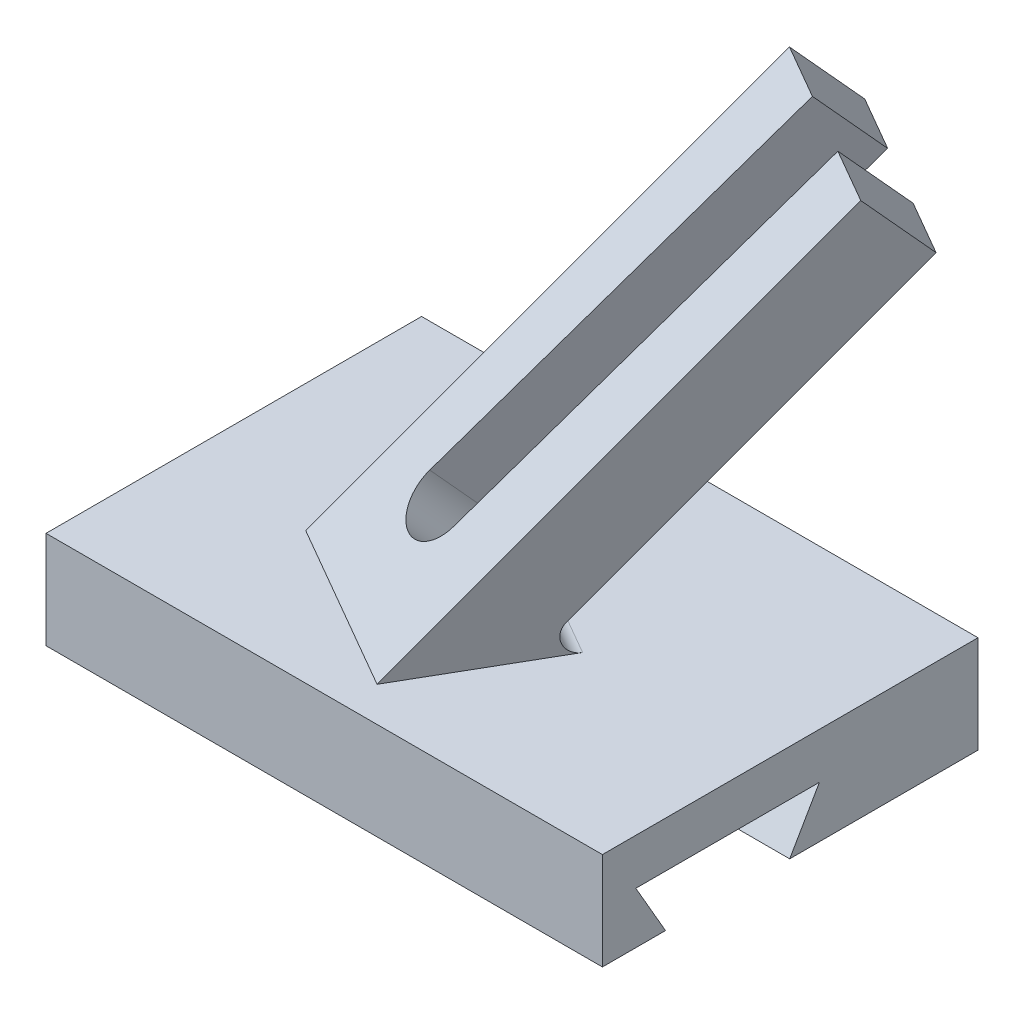
ISO-10303-21;
HEADER;
FILE_DESCRIPTION(('STEP AP214'),'2;1');
FILE_NAME('part.step','',(''),(''),'','','');
FILE_SCHEMA(('AUTOMOTIVE_DESIGN { 1 0 10303 214 1 1 1 1 }'));
ENDSEC;
DATA;
#1=APPLICATION_CONTEXT('core data for automotive mechanical design processes');
#2=APPLICATION_PROTOCOL_DEFINITION('international standard','automotive_design',2000,#1);
#3=PRODUCT_CONTEXT('',#1,'mechanical');
#4=PRODUCT('Part','Part','',(#3));
#5=PRODUCT_RELATED_PRODUCT_CATEGORY('part','',(#4));
#6=PRODUCT_DEFINITION_FORMATION('','',#4);
#7=PRODUCT_DEFINITION_CONTEXT('part definition',#1,'design');
#8=PRODUCT_DEFINITION('design','',#6,#7);
#9=PRODUCT_DEFINITION_SHAPE('','',#8);
#10=(LENGTH_UNIT() NAMED_UNIT(*) SI_UNIT(.MILLI.,.METRE.));
#11=(NAMED_UNIT(*) PLANE_ANGLE_UNIT() SI_UNIT($,.RADIAN.));
#12=(NAMED_UNIT(*) SI_UNIT($,.STERADIAN.) SOLID_ANGLE_UNIT());
#13=UNCERTAINTY_MEASURE_WITH_UNIT(LENGTH_MEASURE(1.E-05),#10,'distance_accuracy_value','');
#14=(GEOMETRIC_REPRESENTATION_CONTEXT(3) GLOBAL_UNCERTAINTY_ASSIGNED_CONTEXT((#13)) GLOBAL_UNIT_ASSIGNED_CONTEXT((#10,
#11,#12)) REPRESENTATION_CONTEXT('',''));
#15=CARTESIAN_POINT('',(0.,0.,0.));
#16=DIRECTION('',(0.,0.,1.));
#17=DIRECTION('',(1.,0.,0.));
#18=AXIS2_PLACEMENT_3D('',#15,#16,#17);
#19=CARTESIAN_POINT('',(0.,0.,0.));
#20=DIRECTION('',(0.,1.,0.));
#21=DIRECTION('',(0.,0.,1.));
#22=AXIS2_PLACEMENT_3D('',#19,#20,#21);
#23=PLANE('',#22);
#24=DIRECTION('',(0.,0.,-1.));
#25=VECTOR('',#24,1.);
#26=CARTESIAN_POINT('',(1.52272727272726,0.,-67.5459090909091));
#27=LINE('',#26,#25);
#28=CARTESIAN_POINT('',(1.52272727272727,0.,-33.1639712610649));
#29=VERTEX_POINT('',#28);
#30=CARTESIAN_POINT('',(1.52272727272726,0.,-67.5459090909091));
#31=VERTEX_POINT('',#30);
#32=EDGE_CURVE('E282',#29,#31,#27,.T.);
#33=ORIENTED_EDGE('',*,*,#32,.F.);
#34=DIRECTION('',(1.,0.,0.));
#35=VECTOR('',#34,1.);
#36=CARTESIAN_POINT('',(-100.077272727273,0.,-33.1639712610649));
#37=LINE('',#36,#35);
#38=CARTESIAN_POINT('',(-100.077272727273,0.,-33.1639712610649));
#39=VERTEX_POINT('',#38);
#40=EDGE_CURVE('E209',#39,#29,#37,.T.);
#41=ORIENTED_EDGE('',*,*,#40,.F.);
#42=DIRECTION('',(0.,0.,1.));
#43=VECTOR('',#42,1.);
#44=CARTESIAN_POINT('',(-100.077272727273,0.,-67.5459090909091));
#45=LINE('',#44,#43);
#46=CARTESIAN_POINT('',(-100.077272727273,0.,-67.5459090909091));
#47=VERTEX_POINT('',#46);
#48=EDGE_CURVE('E201',#47,#39,#45,.T.);
#49=ORIENTED_EDGE('',*,*,#48,.F.);
#50=DIRECTION('',(-1.,0.,0.));
#51=VECTOR('',#50,1.);
#52=CARTESIAN_POINT('',(-100.077272727273,0.,-67.5459090909091));
#53=LINE('',#52,#51);
#54=EDGE_CURVE('E272',#31,#47,#53,.T.);
#55=ORIENTED_EDGE('',*,*,#54,.F.);
#56=EDGE_LOOP('',(#33,#41,#49,#55));
#57=FACE_BOUND('',#56,.T.);
#58=ADVANCED_FACE('F39',(#57),#23,.F.);
#59=CARTESIAN_POINT('',(-39.4132706222002,72.3799572161006,-87.8016301362695));
#60=DIRECTION('',(0.353553390593269,0.707106781186549,-0.612372435695796));
#61=DIRECTION('',(0.,0.654653670707977,0.755928946018454));
#62=AXIS2_PLACEMENT_3D('',#59,#60,#61);
#63=PLANE('',#62);
#64=DIRECTION('',(-0.866025403784442,0.,-0.499999999999994));
#65=VECTOR('',#64,1.);
#66=CARTESIAN_POINT('',(-39.4132706222002,72.3799572161006,-87.8016301362695));
#67=LINE('',#66,#65);
#68=CARTESIAN_POINT('',(-8.61740726362549,72.3799572161006,-70.0216301362696));
#69=VERTEX_POINT('',#68);
#70=CARTESIAN_POINT('',(-18.5160776288816,72.3799572161006,-75.7366301362696));
#71=VERTEX_POINT('',#70);
#72=EDGE_CURVE('E246',#69,#71,#67,.T.);
#73=ORIENTED_EDGE('',*,*,#72,.T.);
#74=DIRECTION('',(-0.353553390593271,0.707106781186546,0.612372435695798));
#75=VECTOR('',#74,1.);
#76=CARTESIAN_POINT('',(-18.5160776288816,72.3799572161006,-75.7366301362696));
#77=LINE('',#76,#75);
#78=CARTESIAN_POINT('',(-23.5450210566803,82.437844071698,-67.0262446109326));
#79=VERTEX_POINT('',#78);
#80=EDGE_CURVE('E237',#71,#79,#77,.T.);
#81=ORIENTED_EDGE('',*,*,#80,.T.);
#82=DIRECTION('',(-0.866025403784442,0.,-0.499999999999994));
#83=VECTOR('',#82,1.);
#84=CARTESIAN_POINT('',(-44.4422140499989,82.437844071698,-79.0912446109324));
#85=LINE('',#84,#83);
#86=CARTESIAN_POINT('',(-13.6463506914242,82.437844071698,-61.3112446109326));
#87=VERTEX_POINT('',#86);
#88=EDGE_CURVE('E256',#87,#79,#85,.T.);
#89=ORIENTED_EDGE('',*,*,#88,.F.);
#90=DIRECTION('',(-0.353553390593271,0.707106781186546,0.612372435695798));
#91=VECTOR('',#90,1.);
#92=CARTESIAN_POINT('',(-8.61740726362549,72.3799572161006,-70.0216301362696));
#93=LINE('',#92,#91);
#94=EDGE_CURVE('E252',#69,#87,#93,.T.);
#95=ORIENTED_EDGE('',*,*,#94,.F.);
#96=EDGE_LOOP('',(#73,#81,#89,#95));
#97=FACE_BOUND('',#96,.T.);
#98=ADVANCED_FACE('F379',(#97),#63,.T.);
#99=CARTESIAN_POINT('',(-4.01203758387629,8.02407516775263,6.94905293714971));
#100=DIRECTION('',(0.353553390593271,-0.707106781186546,-0.612372435695798));
#101=DIRECTION('',(0.,0.65465367070798,-0.755928946018452));
#102=AXIS2_PLACEMENT_3D('',#99,#100,#101);
#103=PLANE('',#102);
#104=DIRECTION('',(-0.370564082989003,-0.706969255440777,0.602392506809333));
#105=VECTOR('',#104,1.);
#106=CARTESIAN_POINT('',(-62.7474262891084,8.97773515873692,-28.0630312477932));
#107=LINE('',#106,#105);
#108=CARTESIAN_POINT('',(-29.514600256944,72.3799572161006,-82.0866301362695));
#109=VERTEX_POINT('',#108);
#110=CARTESIAN_POINT('',(-55.4063078825857,22.9832614690566,-39.9968233304452));
#111=VERTEX_POINT('',#110);
#112=EDGE_CURVE('E221',#109,#111,#107,.T.);
#113=ORIENTED_EDGE('',*,*,#112,.T.);
#114=DIRECTION('',(-0.866025403784442,0.,-0.499999999999995));
#115=VECTOR('',#114,1.);
#116=CARTESIAN_POINT('',(-64.1116184957219,22.9832614690566,-45.0228367563186));
#117=LINE('',#116,#115);
#118=CARTESIAN_POINT('',(-64.1116184957219,22.9832614690566,-45.0228367563186));
#119=VERTEX_POINT('',#118);
#120=EDGE_CURVE('E305',#111,#119,#117,.T.);
#121=ORIENTED_EDGE('',*,*,#120,.T.);
#122=DIRECTION('',(-0.353553390593269,-0.707106781186549,0.612372435695796));
#123=VECTOR('',#122,1.);
#124=CARTESIAN_POINT('',(-71.7421926580488,7.72211314440257,-31.8062946162459));
#125=LINE('',#124,#123);
#126=CARTESIAN_POINT('',(-39.4132706222002,72.3799572161006,-87.8016301362695));
#127=VERTEX_POINT('',#126);
#128=EDGE_CURVE('E249',#127,#119,#125,.T.);
#129=ORIENTED_EDGE('',*,*,#128,.F.);
#130=EDGE_CURVE('E244',#109,#127,#67,.T.);
#131=ORIENTED_EDGE('',*,*,#130,.F.);
#132=EDGE_LOOP('',(#113,#121,#129,#131));
#133=FACE_BOUND('',#132,.T.);
#134=ADVANCED_FACE('F345',(#133),#103,.T.);
#135=DIRECTION('',(0.353553390593269,0.707106781186549,-0.612372435695796));
#136=VECTOR('',#135,1.);
#137=CARTESIAN_POINT('',(-8.61740726362549,72.3799572161006,-70.0216301362696));
#138=LINE('',#137,#136);
#139=CARTESIAN_POINT('',(-33.3157551371471,22.9832614690566,-27.2428367563188));
#140=VERTEX_POINT('',#139);
#141=EDGE_CURVE('E242',#140,#69,#138,.T.);
#142=ORIENTED_EDGE('',*,*,#141,.F.);
#143=DIRECTION('',(-0.866025403784442,0.,-0.499999999999995));
#144=VECTOR('',#143,1.);
#145=CARTESIAN_POINT('',(-46.8985065810605,22.9832614690566,-35.0848419587978));
#146=LINE('',#145,#144);
#147=CARTESIAN_POINT('',(-44.4077852545233,22.9832614690566,-33.6468233304453));
#148=VERTEX_POINT('',#147);
#149=EDGE_CURVE('E317',#140,#148,#146,.T.);
#150=ORIENTED_EDGE('',*,*,#149,.T.);
#151=DIRECTION('',(-0.370564082989003,-0.706969255440777,0.602392506809333));
#152=VECTOR('',#151,1.);
#153=CARTESIAN_POINT('',(-51.841717006566,8.80066408037458,-21.5621529882972));
#154=LINE('',#153,#152);
#155=EDGE_CURVE('E217',#71,#148,#154,.T.);
#156=ORIENTED_EDGE('',*,*,#155,.F.);
#157=ORIENTED_EDGE('',*,*,#72,.F.);
#158=EDGE_LOOP('',(#142,#150,#156,#157));
#159=FACE_BOUND('',#158,.T.);
#160=ADVANCED_FACE('F387',(#159),#103,.T.);
#161=CARTESIAN_POINT('',(-100.077272727273,17.78,-67.5459090909091));
#162=DIRECTION('',(1.,0.,0.));
#163=DIRECTION('',(0.,0.,-1.));
#164=AXIS2_PLACEMENT_3D('',#161,#162,#163);
#165=PLANE('',#164);
#166=ORIENTED_EDGE('',*,*,#48,.T.);
#167=DIRECTION('',(0.,0.866025403784436,-0.500000000000004));
#168=VECTOR('',#167,1.);
#169=CARTESIAN_POINT('',(-100.077272727273,9.39800000000001,-38.5899090909091));
#170=LINE('',#169,#168);
#171=CARTESIAN_POINT('',(-100.077272727273,9.39800000000001,-38.5899090909091));
#172=VERTEX_POINT('',#171);
#173=EDGE_CURVE('E180',#39,#172,#170,.T.);
#174=ORIENTED_EDGE('',*,*,#173,.T.);
#175=DIRECTION('',(0.,0.,1.));
#176=VECTOR('',#175,1.);
#177=CARTESIAN_POINT('',(-100.077272727273,9.398,-5.06190909090907));
#178=LINE('',#177,#176);
#179=CARTESIAN_POINT('',(-100.077272727273,9.398,-5.06190909090907));
#180=VERTEX_POINT('',#179);
#181=EDGE_CURVE('E191',#172,#180,#178,.T.);
#182=ORIENTED_EDGE('',*,*,#181,.T.);
#183=DIRECTION('',(0.,-0.86602540378444,-0.499999999999998));
#184=VECTOR('',#183,1.);
#185=CARTESIAN_POINT('',(-100.077272727273,9.398,-5.06190909090907));
#186=LINE('',#185,#184);
#187=CARTESIAN_POINT('',(-100.077272727273,0.,-10.4878469207531));
#188=VERTEX_POINT('',#187);
#189=EDGE_CURVE('E188',#180,#188,#186,.T.);
#190=ORIENTED_EDGE('',*,*,#189,.T.);
#191=CARTESIAN_POINT('',(-100.077272727273,0.,1.03409090909091));
#192=VERTEX_POINT('',#191);
#193=EDGE_CURVE('E266',#188,#192,#45,.T.);
#194=ORIENTED_EDGE('',*,*,#193,.T.);
#195=DIRECTION('',(0.,-1.,0.));
#196=VECTOR('',#195,1.);
#197=CARTESIAN_POINT('',(-100.077272727273,17.78,1.03409090909091));
#198=LINE('',#197,#196);
#199=CARTESIAN_POINT('',(-100.077272727273,17.78,1.03409090909091));
#200=VERTEX_POINT('',#199);
#201=EDGE_CURVE('E294',#200,#192,#198,.T.);
#202=ORIENTED_EDGE('',*,*,#201,.F.);
#203=DIRECTION('',(0.,0.,1.));
#204=VECTOR('',#203,1.);
#205=CARTESIAN_POINT('',(-100.077272727273,17.78,-67.5459090909091));
#206=LINE('',#205,#204);
#207=CARTESIAN_POINT('',(-100.077272727273,17.78,-67.5459090909091));
#208=VERTEX_POINT('',#207);
#209=EDGE_CURVE('E268',#208,#200,#206,.T.);
#210=ORIENTED_EDGE('',*,*,#209,.F.);
#211=DIRECTION('',(0.,-1.,0.));
#212=VECTOR('',#211,1.);
#213=CARTESIAN_POINT('',(-100.077272727273,17.78,-67.5459090909091));
#214=LINE('',#213,#212);
#215=EDGE_CURVE('E278',#208,#47,#214,.T.);
#216=ORIENTED_EDGE('',*,*,#215,.T.);
#217=EDGE_LOOP('',(#166,#174,#182,#190,#194,#202,#210,#216));
#218=FACE_BOUND('',#217,.T.);
#219=ADVANCED_FACE('F198',(#218),#165,.F.);
#220=CARTESIAN_POINT('',(-100.077272727273,17.78,1.03409090909091));
#221=DIRECTION('',(0.,0.,-1.));
#222=DIRECTION('',(-1.,0.,0.));
#223=AXIS2_PLACEMENT_3D('',#220,#221,#222);
#224=PLANE('',#223);
#225=DIRECTION('',(1.,0.,0.));
#226=VECTOR('',#225,1.);
#227=CARTESIAN_POINT('',(-100.077272727273,0.,1.03409090909091));
#228=LINE('',#227,#226);
#229=CARTESIAN_POINT('',(1.52272727272727,0.,1.03409090909091));
#230=VERTEX_POINT('',#229);
#231=EDGE_CURVE('E280',#192,#230,#228,.T.);
#232=ORIENTED_EDGE('',*,*,#231,.T.);
#233=DIRECTION('',(0.,-1.,0.));
#234=VECTOR('',#233,1.);
#235=CARTESIAN_POINT('',(1.52272727272727,17.78,1.03409090909091));
#236=LINE('',#235,#234);
#237=CARTESIAN_POINT('',(1.52272727272727,17.78,1.03409090909091));
#238=VERTEX_POINT('',#237);
#239=EDGE_CURVE('E291',#238,#230,#236,.T.);
#240=ORIENTED_EDGE('',*,*,#239,.F.);
#241=DIRECTION('',(1.,0.,0.));
#242=VECTOR('',#241,1.);
#243=CARTESIAN_POINT('',(-100.077272727273,17.78,1.03409090909091));
#244=LINE('',#243,#242);
#245=EDGE_CURVE('E271',#200,#238,#244,.T.);
#246=ORIENTED_EDGE('',*,*,#245,.F.);
#247=ORIENTED_EDGE('',*,*,#201,.T.);
#248=EDGE_LOOP('',(#232,#240,#246,#247));
#249=FACE_BOUND('',#248,.T.);
#250=ADVANCED_FACE('F442',(#249),#224,.F.);
#251=CARTESIAN_POINT('',(1.52272727272726,17.78,-67.5459090909091));
#252=DIRECTION('',(-1.,0.,0.));
#253=DIRECTION('',(0.,0.,1.));
#254=AXIS2_PLACEMENT_3D('',#251,#252,#253);
#255=PLANE('',#254);
#256=DIRECTION('',(0.,0.,1.));
#257=VECTOR('',#256,1.);
#258=CARTESIAN_POINT('',(1.52272727272727,9.398,-5.06190909090909));
#259=LINE('',#258,#257);
#260=CARTESIAN_POINT('',(1.52272727272727,9.39800000000001,-38.5899090909091));
#261=VERTEX_POINT('',#260);
#262=CARTESIAN_POINT('',(1.52272727272727,9.398,-5.06190909090909));
#263=VERTEX_POINT('',#262);
#264=EDGE_CURVE('E203',#261,#263,#259,.T.);
#265=ORIENTED_EDGE('',*,*,#264,.F.);
#266=DIRECTION('',(0.,0.866025403784436,-0.500000000000004));
#267=VECTOR('',#266,1.);
#268=CARTESIAN_POINT('',(1.52272727272727,9.39800000000001,-38.5899090909091));
#269=LINE('',#268,#267);
#270=EDGE_CURVE('E183',#29,#261,#269,.T.);
#271=ORIENTED_EDGE('',*,*,#270,.F.);
#272=ORIENTED_EDGE('',*,*,#32,.T.);
#273=DIRECTION('',(0.,-1.,0.));
#274=VECTOR('',#273,1.);
#275=CARTESIAN_POINT('',(1.52272727272726,17.78,-67.5459090909091));
#276=LINE('',#275,#274);
#277=CARTESIAN_POINT('',(1.52272727272726,17.78,-67.5459090909091));
#278=VERTEX_POINT('',#277);
#279=EDGE_CURVE('E288',#278,#31,#276,.T.);
#280=ORIENTED_EDGE('',*,*,#279,.F.);
#281=DIRECTION('',(0.,0.,-1.));
#282=VECTOR('',#281,1.);
#283=CARTESIAN_POINT('',(1.52272727272726,17.78,-67.5459090909091));
#284=LINE('',#283,#282);
#285=EDGE_CURVE('E274',#238,#278,#284,.T.);
#286=ORIENTED_EDGE('',*,*,#285,.F.);
#287=ORIENTED_EDGE('',*,*,#239,.T.);
#288=CARTESIAN_POINT('',(1.52272727272727,0.,-10.4878469207532));
#289=VERTEX_POINT('',#288);
#290=EDGE_CURVE('E283',#230,#289,#27,.T.);
#291=ORIENTED_EDGE('',*,*,#290,.T.);
#292=DIRECTION('',(0.,-0.86602540378444,-0.499999999999998));
#293=VECTOR('',#292,1.);
#294=CARTESIAN_POINT('',(1.52272727272727,9.398,-5.06190909090909));
#295=LINE('',#294,#293);
#296=EDGE_CURVE('E55',#263,#289,#295,.T.);
#297=ORIENTED_EDGE('',*,*,#296,.F.);
#298=EDGE_LOOP('',(#265,#271,#272,#280,#286,#287,#291,#297));
#299=FACE_BOUND('',#298,.T.);
#300=ADVANCED_FACE('F437',(#299),#255,.F.);
#301=CARTESIAN_POINT('',(-100.077272727273,17.78,-67.5459090909091));
#302=DIRECTION('',(0.,0.,1.));
#303=DIRECTION('',(1.,0.,0.));
#304=AXIS2_PLACEMENT_3D('',#301,#302,#303);
#305=PLANE('',#304);
#306=ORIENTED_EDGE('',*,*,#54,.T.);
#307=ORIENTED_EDGE('',*,*,#215,.F.);
#308=DIRECTION('',(-1.,0.,0.));
#309=VECTOR('',#308,1.);
#310=CARTESIAN_POINT('',(-100.077272727273,17.78,-67.5459090909091));
#311=LINE('',#310,#309);
#312=EDGE_CURVE('E276',#278,#208,#311,.T.);
#313=ORIENTED_EDGE('',*,*,#312,.F.);
#314=ORIENTED_EDGE('',*,*,#279,.T.);
#315=EDGE_LOOP('',(#306,#307,#313,#314));
#316=FACE_BOUND('',#315,.T.);
#317=ADVANCED_FACE('F429',(#316),#305,.F.);
#318=CARTESIAN_POINT('',(0.,17.78,0.));
#319=DIRECTION('',(0.,1.,0.));
#320=DIRECTION('',(0.,0.,1.));
#321=AXIS2_PLACEMENT_3D('',#318,#319,#320);
#322=PLANE('',#321);
#323=DIRECTION('',(-0.499999999999995,0.,0.866025403784442));
#324=VECTOR('',#323,1.);
#325=CARTESIAN_POINT('',(-67.5791740624975,17.78,-39.0168543365949));
#326=LINE('',#325,#324);
#327=CARTESIAN_POINT('',(-63.0339877611936,17.78,-46.8893479403194));
#328=VERTEX_POINT('',#327);
#329=CARTESIAN_POINT('',(-76.7711360858474,17.78,-23.0959090909089));
#330=VERTEX_POINT('',#329);
#331=EDGE_CURVE('E297',#328,#330,#326,.T.);
#332=ORIENTED_EDGE('',*,*,#331,.F.);
#333=DIRECTION('',(-0.866025403784442,0.,-0.499999999999995));
#334=VECTOR('',#333,1.);
#335=CARTESIAN_POINT('',(-51.9087290597549,17.78,-40.4661768342397));
#336=LINE('',#335,#334);
#337=CARTESIAN_POINT('',(-54.3625154334753,17.78,-41.8828710576409));
#338=VERTEX_POINT('',#337);
#339=EDGE_CURVE('E314',#328,#338,#336,.F.);
#340=ORIENTED_EDGE('',*,*,#339,.T.);
#341=CARTESIAN_POINT('',(-48.8055594595297,17.78,-38.8113768634507));
#342=DIRECTION('',(0.,1.,0.));
#343=DIRECTION('',(-0.499999999999995,0.,0.866025403784442));
#344=AXIS2_PLACEMENT_3D('',#341,#342,#343);
#345=ELLIPSE('',#344,8.97850954409787,6.34876498357973);
#346=CARTESIAN_POINT('',(-55.5879905288115,17.78,-34.0935090355031));
#347=VERTEX_POINT('',#346);
#348=EDGE_CURVE('E312',#338,#347,#345,.T.);
#349=ORIENTED_EDGE('',*,*,#348,.T.);
#350=DIRECTION('',(-0.866025403784442,0.,-0.499999999999995));
#351=VECTOR('',#350,1.);
#352=CARTESIAN_POINT('',(0.865924832247326,17.78,-1.49982580498795));
#353=LINE('',#352,#351);
#354=CARTESIAN_POINT('',(-49.5001373155887,17.78,-30.5786853440621));
#355=VERTEX_POINT('',#354);
#356=EDGE_CURVE('E300',#355,#347,#353,.T.);
#357=ORIENTED_EDGE('',*,*,#356,.F.);
#358=CARTESIAN_POINT('',(-48.8055594595297,17.78,-38.8113768634507));
#359=DIRECTION('',(0.,1.,0.));
#360=DIRECTION('',(-0.499999999999995,0.,0.866025403784442));
#361=AXIS2_PLACEMENT_3D('',#358,#359,#360);
#362=ELLIPSE('',#361,8.97850954409787,6.34876498357973);
#363=CARTESIAN_POINT('',(-43.3670894728118,17.78,-35.5346589193974));
#364=VERTEX_POINT('',#363);
#365=EDGE_CURVE('E63',#355,#364,#362,.T.);
#366=ORIENTED_EDGE('',*,*,#365,.T.);
#367=DIRECTION('',(-0.866025403784442,0.,-0.499999999999995));
#368=VECTOR('',#367,1.);
#369=CARTESIAN_POINT('',(-32.2381244026188,17.78,-29.1093479403196));
#370=LINE('',#369,#368);
#371=CARTESIAN_POINT('',(-32.2381244026189,17.78,-29.1093479403196));
#372=VERTEX_POINT('',#371);
#373=EDGE_CURVE('E308',#364,#372,#370,.F.);
#374=ORIENTED_EDGE('',*,*,#373,.T.);
#375=DIRECTION('',(0.499999999999995,0.,-0.866025403784442));
#376=VECTOR('',#375,1.);
#377=CARTESIAN_POINT('',(-36.7833107039227,17.78,-21.2368543365951));
#378=LINE('',#377,#376);
#379=CARTESIAN_POINT('',(-45.9752727272727,17.78,-5.31590909090908));
#380=VERTEX_POINT('',#379);
#381=EDGE_CURVE('E303',#380,#372,#378,.T.);
#382=ORIENTED_EDGE('',*,*,#381,.F.);
#383=DIRECTION('',(0.866025403784442,0.,0.499999999999995));
#384=VECTOR('',#383,1.);
#385=CARTESIAN_POINT('',(-45.9752727272727,17.78,-5.31590909090908));
#386=LINE('',#385,#384);
#387=EDGE_CURVE('E245',#330,#380,#386,.T.);
#388=ORIENTED_EDGE('',*,*,#387,.F.);
#389=EDGE_LOOP('',(#332,#340,#349,#357,#366,#374,#382,#388));
#390=FACE_BOUND('',#389,.T.);
#391=ORIENTED_EDGE('',*,*,#209,.T.);
#392=ORIENTED_EDGE('',*,*,#245,.T.);
#393=ORIENTED_EDGE('',*,*,#285,.T.);
#394=ORIENTED_EDGE('',*,*,#312,.T.);
#395=EDGE_LOOP('',(#391,#392,#393,#394));
#396=FACE_BOUND('',#395,.T.);
#397=ADVANCED_FACE('F393',(#390,#396),#322,.T.);
#398=ORIENTED_EDGE('',*,*,#193,.F.);
#399=DIRECTION('',(1.,0.,0.));
#400=VECTOR('',#399,1.);
#401=CARTESIAN_POINT('',(-100.077272727273,0.,-10.4878469207531));
#402=LINE('',#401,#400);
#403=EDGE_CURVE('E212',#188,#289,#402,.T.);
#404=ORIENTED_EDGE('',*,*,#403,.T.);
#405=ORIENTED_EDGE('',*,*,#290,.F.);
#406=ORIENTED_EDGE('',*,*,#231,.F.);
#407=EDGE_LOOP('',(#398,#404,#405,#406));
#408=FACE_BOUND('',#407,.T.);
#409=ADVANCED_FACE('F410',(#408),#23,.F.);
#410=CARTESIAN_POINT('',(-8.61740726362549,72.3799572161006,-70.0216301362696));
#411=DIRECTION('',(0.866025403784442,0.,0.499999999999995));
#412=DIRECTION('',(0.499999999999995,0.,-0.866025403784442));
#413=AXIS2_PLACEMENT_3D('',#410,#411,#412);
#414=PLANE('',#413);
#415=DIRECTION('',(0.353553390593269,0.707106781186549,-0.612372435695796));
#416=VECTOR('',#415,1.);
#417=CARTESIAN_POINT('',(-13.6463506914242,82.437844071698,-61.3112446109326));
#418=LINE('',#417,#416);
#419=EDGE_CURVE('E234',#380,#87,#418,.T.);
#420=ORIENTED_EDGE('',*,*,#419,.F.);
#421=ORIENTED_EDGE('',*,*,#381,.T.);
#422=CARTESIAN_POINT('',(-32.2381244026189,20.828,-29.1093479403196));
#423=DIRECTION('',(0.866025403784442,0.,0.499999999999995));
#424=DIRECTION('',(0.499999999999995,0.,-0.866025403784442));
#425=AXIS2_PLACEMENT_3D('',#422,#423,#424);
#426=CIRCLE('',#425,3.048);
#427=EDGE_CURVE('E11',#372,#140,#426,.F.);
#428=ORIENTED_EDGE('',*,*,#427,.T.);
#429=ORIENTED_EDGE('',*,*,#141,.T.);
#430=ORIENTED_EDGE('',*,*,#94,.T.);
#431=EDGE_LOOP('',(#420,#421,#428,#429,#430));
#432=FACE_BOUND('',#431,.T.);
#433=ADVANCED_FACE('F384',(#432),#414,.T.);
#434=CARTESIAN_POINT('',(-71.7421926580488,7.72211314440257,-31.8062946162459));
#435=DIRECTION('',(-0.866025403784442,0.,-0.499999999999995));
#436=DIRECTION('',(-0.499999999999995,0.,0.866025403784442));
#437=AXIS2_PLACEMENT_3D('',#434,#435,#436);
#438=PLANE('',#437);
#439=ORIENTED_EDGE('',*,*,#128,.T.);
#440=CARTESIAN_POINT('',(-63.0339877611936,20.828,-46.8893479403194));
#441=DIRECTION('',(-0.866025403784442,0.,-0.499999999999995));
#442=DIRECTION('',(-0.499999999999995,0.,0.866025403784442));
#443=AXIS2_PLACEMENT_3D('',#440,#441,#442);
#444=CIRCLE('',#443,3.048);
#445=EDGE_CURVE('E320',#119,#328,#444,.F.);
#446=ORIENTED_EDGE('',*,*,#445,.T.);
#447=ORIENTED_EDGE('',*,*,#331,.T.);
#448=DIRECTION('',(-0.353553390593269,-0.707106781186549,0.612372435695796));
#449=VECTOR('',#448,1.);
#450=CARTESIAN_POINT('',(-76.7711360858474,17.78,-23.0959090909089));
#451=LINE('',#450,#449);
#452=CARTESIAN_POINT('',(-44.4422140499989,82.437844071698,-79.0912446109324));
#453=VERTEX_POINT('',#452);
#454=EDGE_CURVE('E259',#453,#330,#451,.T.);
#455=ORIENTED_EDGE('',*,*,#454,.F.);
#456=DIRECTION('',(-0.353553390593271,0.707106781186546,0.612372435695798));
#457=VECTOR('',#456,1.);
#458=CARTESIAN_POINT('',(-39.4132706222002,72.3799572161006,-87.8016301362695));
#459=LINE('',#458,#457);
#460=EDGE_CURVE('E263',#127,#453,#459,.T.);
#461=ORIENTED_EDGE('',*,*,#460,.F.);
#462=EDGE_LOOP('',(#439,#446,#447,#455,#461));
#463=FACE_BOUND('',#462,.T.);
#464=ADVANCED_FACE('F367',(#463),#438,.T.);
#465=DIRECTION('',(-0.353553390593271,0.707106781186546,0.612372435695798));
#466=VECTOR('',#465,1.);
#467=CARTESIAN_POINT('',(-29.514600256944,72.3799572161006,-82.0866301362695));
#468=LINE('',#467,#466);
#469=CARTESIAN_POINT('',(-34.5435436847427,82.437844071698,-73.3762446109325));
#470=VERTEX_POINT('',#469);
#471=EDGE_CURVE('E235',#109,#470,#468,.T.);
#472=ORIENTED_EDGE('',*,*,#471,.F.);
#473=ORIENTED_EDGE('',*,*,#130,.T.);
#474=ORIENTED_EDGE('',*,*,#460,.T.);
#475=EDGE_CURVE('E255',#470,#453,#85,.T.);
#476=ORIENTED_EDGE('',*,*,#475,.F.);
#477=EDGE_LOOP('',(#472,#473,#474,#476));
#478=FACE_BOUND('',#477,.T.);
#479=ADVANCED_FACE('F373',(#478),#63,.T.);
#480=CARTESIAN_POINT('',(-9.04098101167497,18.0819620233501,15.6594384624867));
#481=DIRECTION('',(0.353553390593271,-0.707106781186546,-0.612372435695798));
#482=DIRECTION('',(0.,0.65465367070798,-0.755928946018452));
#483=AXIS2_PLACEMENT_3D('',#480,#481,#482);
#484=PLANE('',#483);
#485=CARTESIAN_POINT('',(-55.7037551186636,31.5763913182678,-26.8633515012796));
#486=DIRECTION('',(-0.353553390593271,0.707106781186546,0.612372435695798));
#487=DIRECTION('',(0.,-0.65465367070798,0.755928946018452));
#488=AXIS2_PLACEMENT_3D('',#485,#486,#487);
#489=CIRCLE('',#488,6.34876498357973);
#490=CARTESIAN_POINT('',(-50.2509004773924,31.4878557790866,-23.6129123715316));
#491=VERTEX_POINT('',#490);
#492=CARTESIAN_POINT('',(-61.1566097599349,31.664926857449,-30.1137906310276));
#493=VERTEX_POINT('',#492);
#494=EDGE_CURVE('E211',#491,#493,#489,.F.);
#495=ORIENTED_EDGE('',*,*,#494,.T.);
#496=DIRECTION('',(-0.370564082989003,-0.706969255440777,0.602392506809333));
#497=VECTOR('',#496,1.);
#498=CARTESIAN_POINT('',(-67.7763697169071,19.0356220143344,-19.3526457224562));
#499=LINE('',#498,#497);
#500=EDGE_CURVE('E218',#470,#493,#499,.T.);
#501=ORIENTED_EDGE('',*,*,#500,.F.);
#502=ORIENTED_EDGE('',*,*,#475,.T.);
#503=ORIENTED_EDGE('',*,*,#454,.T.);
#504=ORIENTED_EDGE('',*,*,#387,.T.);
#505=ORIENTED_EDGE('',*,*,#419,.T.);
#506=ORIENTED_EDGE('',*,*,#88,.T.);
#507=DIRECTION('',(-0.370564082989003,-0.706969255440777,0.602392506809333));
#508=VECTOR('',#507,1.);
#509=CARTESIAN_POINT('',(-56.8706604343646,18.858550935972,-12.8517674629602));
#510=LINE('',#509,#508);
#511=EDGE_CURVE('E227',#79,#491,#510,.T.);
#512=ORIENTED_EDGE('',*,*,#511,.T.);
#513=EDGE_LOOP('',(#495,#501,#502,#503,#504,#505,#506,#512));
#514=FACE_BOUND('',#513,.T.);
#515=ADVANCED_FACE('F342',(#514),#484,.F.);
#516=CARTESIAN_POINT('',(-50.6748116908649,21.5185044626704,-35.5737370266167));
#517=DIRECTION('',(-0.353553390593271,0.707106781186546,0.612372435695798));
#518=DIRECTION('',(0.,-0.65465367070798,0.755928946018452));
#519=AXIS2_PLACEMENT_3D('',#516,#517,#518);
#520=CYLINDRICAL_SURFACE('',#519,6.34876498357973);
#521=ORIENTED_EDGE('',*,*,#494,.F.);
#522=DIRECTION('',(-0.353553390593271,0.707106781186546,0.612372435695798));
#523=VECTOR('',#522,1.);
#524=CARTESIAN_POINT('',(-45.2219570495937,21.4299689234892,-32.3232978968687));
#525=LINE('',#524,#523);
#526=CARTESIAN_POINT('',(-44.8913929566518,20.7688407376055,-32.8958517010019));
#527=VERTEX_POINT('',#526);
#528=EDGE_CURVE('E224',#527,#491,#525,.T.);
#529=ORIENTED_EDGE('',*,*,#528,.F.);
#530=CARTESIAN_POINT('',(-44.8913929566518,20.7688407376055,-32.8958517010019));
#531=CARTESIAN_POINT('',(-44.8915811278913,20.683222975722,-32.8978702747974));
#532=CARTESIAN_POINT('',(-44.890632422704,20.597697376445,-32.9034167793155));
#533=CARTESIAN_POINT('',(-44.8861210910908,20.427437209501,-32.9212729107847));
#534=CARTESIAN_POINT('',(-44.882558880127,20.3427025182733,-32.9335814627131));
#535=CARTESIAN_POINT('',(-44.8724827748124,20.1746388095496,-32.9646632064719));
#536=CARTESIAN_POINT('',(-44.8659701287727,20.0913092130162,-32.9834336635042));
#537=CARTESIAN_POINT('',(-44.8497137890101,19.926614833518,-33.0270972715925));
#538=CARTESIAN_POINT('',(-44.839970030646,19.8452500898967,-33.0519905451383));
#539=CARTESIAN_POINT('',(-44.8054958793102,19.6049049665386,-33.1353652634234));
#540=CARTESIAN_POINT('',(-44.7755165812743,19.4495595007109,-33.2025633214961));
#541=CARTESIAN_POINT('',(-44.7004444280975,19.1533767911651,-33.3571026788064));
#542=CARTESIAN_POINT('',(-44.6553575382863,19.0125338496829,-33.4444360232575));
#543=CARTESIAN_POINT('',(-44.5503429164647,18.7494922067829,-33.6360134687493));
#544=CARTESIAN_POINT('',(-44.4904447215177,18.6272571715096,-33.7402237723316));
#545=CARTESIAN_POINT('',(-44.3574183790694,18.404630213421,-33.9626668313868));
#546=CARTESIAN_POINT('',(-44.2842860531649,18.3042452114154,-34.0809040114835));
#547=CARTESIAN_POINT('',(-44.1284444736371,18.1287930818469,-34.3276705484242));
#548=CARTESIAN_POINT('',(-44.0458041809719,18.0535574013669,-34.4561239375628));
#549=CARTESIAN_POINT('',(-43.8746685762359,17.9295109740816,-34.721523678589));
#550=CARTESIAN_POINT('',(-43.7861775872562,17.8806809556434,-34.8584637550606));
#551=CARTESIAN_POINT('',(-43.6417023469417,17.823866032521,-35.0858268355562));
#552=CARTESIAN_POINT('',(-43.5859950852099,17.807428094456,-35.1743984313479));
#553=CARTESIAN_POINT('',(-43.475537358866,17.7854978078751,-35.3533022442331));
#554=CARTESIAN_POINT('',(-43.4207857040796,17.7799907124386,-35.4436319230049));
#555=CARTESIAN_POINT('',(-43.3670894728118,17.78,-35.5346589193974));
#556=B_SPLINE_CURVE_WITH_KNOTS('',3,(#530,#531,#532,#533,#534,#535,#536,#537,#538,#539,#540,
#541,#542,#543,#544,#545,#546,#547,#548,#549,#550,#551,#552,#553,#554,#555),.UNSPECIFIED.,.F.,
.F.,(4,2,2,2,2,2,2,2,2,2,2,2,4),(0.,0.256828136825784,0.513615455216847,0.770294229786983,
1.02697813975311,1.54000113508624,2.05282179823264,2.5646279151359,3.07659590707153,
3.58506042943606,4.09315335680242,4.410367366311,4.72715312721976),.UNSPECIFIED.);
#557=EDGE_CURVE('E48',#527,#364,#556,.T.);
#558=ORIENTED_EDGE('',*,*,#557,.T.);
#559=ORIENTED_EDGE('',*,*,#365,.F.);
#560=CARTESIAN_POINT('',(-50.6748116908649,21.5185044626704,-35.5737370266167));
#561=DIRECTION('',(-0.353553390593271,0.707106781186546,0.612372435695798));
#562=DIRECTION('',(0.,-0.65465367070798,0.755928946018452));
#563=AXIS2_PLACEMENT_3D('',#560,#561,#562);
#564=CIRCLE('',#563,6.34876498357973);
#565=EDGE_CURVE('E215',#355,#347,#564,.F.);
#566=ORIENTED_EDGE('',*,*,#565,.T.);
#567=ORIENTED_EDGE('',*,*,#348,.F.);
#568=CARTESIAN_POINT('',(-54.3625154334753,17.78,-41.8828710576409));
#569=CARTESIAN_POINT('',(-54.4046179134854,17.7799917478127,-41.8083485821424));
#570=CARTESIAN_POINT('',(-54.4459912004236,17.7836050201454,-41.7334276189618));
#571=CARTESIAN_POINT('',(-54.5273564409295,17.7980025047981,-41.5835405579366));
#572=CARTESIAN_POINT('',(-54.5673486388171,17.8087854418699,-41.5085744704869));
#573=CARTESIAN_POINT('',(-54.6460222998441,17.8374424114919,-41.359362498673));
#574=CARTESIAN_POINT('',(-54.6847044629773,17.8553125900805,-41.2851162453137));
#575=CARTESIAN_POINT('',(-54.7608449050454,17.8979977677126,-41.1380304922198));
#576=CARTESIAN_POINT('',(-54.7983031532086,17.9228129412168,-41.0651910278734));
#577=CARTESIAN_POINT('',(-54.9089515749026,18.0074593754425,-40.8497923720149));
#578=CARTESIAN_POINT('',(-54.9804749709776,18.0775137327642,-40.7102374897026));
#579=CARTESIAN_POINT('',(-55.1189334058119,18.242866398868,-40.4446171093012));
#580=CARTESIAN_POINT('',(-55.1858698209366,18.3381570931385,-40.3185475583902));
#581=CARTESIAN_POINT('',(-55.3144843845552,18.5513178660971,-40.084094851696));
#582=CARTESIAN_POINT('',(-55.3761643562446,18.6691800694274,-39.975705551503));
#583=CARTESIAN_POINT('',(-55.4926736580951,18.9241134301506,-39.7798272196641));
#584=CARTESIAN_POINT('',(-55.5475022866647,19.0611865517365,-39.692340327632));
#585=CARTESIAN_POINT('',(-55.6474617154521,19.3493459137699,-39.5408773563947));
#586=CARTESIAN_POINT('',(-55.6926684014886,19.5003079368706,-39.4767142449289));
#587=CARTESIAN_POINT('',(-55.771006523101,19.813144499317,-39.3716016354142));
#588=CARTESIAN_POINT('',(-55.804138409431,19.9750186310444,-39.3306512707982));
#589=CARTESIAN_POINT('',(-55.8417762590106,20.2192045939418,-39.2870308324565));
#590=CARTESIAN_POINT('',(-55.8522116917249,20.2991615560817,-39.2755258833284));
#591=CARTESIAN_POINT('',(-55.869171827304,20.4600770810796,-39.2576870594213));
#592=CARTESIAN_POINT('',(-55.8756968401287,20.5410355640325,-39.2513527747745));
#593=CARTESIAN_POINT('',(-55.8844718343299,20.7034787373931,-39.2437270872168));
#594=CARTESIAN_POINT('',(-55.8867186243834,20.7849637751567,-39.2424394480737));
#595=CARTESIAN_POINT('',(-55.8865930476349,20.9478823947246,-39.2447332424964));
#596=CARTESIAN_POINT('',(-55.8842194303184,21.0293159566298,-39.2483159941555));
#597=CARTESIAN_POINT('',(-55.8793676290048,21.1104425955889,-39.2542421256416));
#598=B_SPLINE_CURVE_WITH_KNOTS('',3,(#568,#569,#570,#571,#572,#573,#574,#575,#576,#577,#578,
#579,#580,#581,#582,#583,#584,#585,#586,#587,#588,#589,#590,#591,#592,#593,#594,#595,#596,#597),
.UNSPECIFIED.,.F.,.F.,(4,2,2,2,2,2,2,2,2,2,2,2,2,2,4),(0.,0.256681594653203,0.513317546279796,
0.769814133115828,1.02631716381317,1.53893287227383,2.05139408605172,2.56367682321073,
3.07601197625059,3.58414305182574,4.09225515684485,4.33639813272404,4.58052175402143,
4.82482740712017,5.06919919080354),.UNSPECIFIED.);
#599=CARTESIAN_POINT('',(-55.8793676290048,21.1104425955889,-39.2542421256416));
#600=VERTEX_POINT('',#599);
#601=EDGE_CURVE('E323',#338,#600,#598,.T.);
#602=ORIENTED_EDGE('',*,*,#601,.T.);
#603=DIRECTION('',(-0.353553390593271,0.707106781186546,0.612372435695798));
#604=VECTOR('',#603,1.);
#605=CARTESIAN_POINT('',(-56.1276663321362,21.6070400018516,-38.8241761563647));
#606=LINE('',#605,#604);
#607=EDGE_CURVE('E232',#600,#493,#606,.T.);
#608=ORIENTED_EDGE('',*,*,#607,.T.);
#609=EDGE_LOOP('',(#521,#529,#558,#559,#566,#567,#602,#608));
#610=FACE_BOUND('',#609,.T.);
#611=ADVANCED_FACE('F336',(#610),#520,.F.);
#612=CARTESIAN_POINT('',(-62.7474262891084,8.97773515873692,-28.0630312477932));
#613=DIRECTION('',(-0.858884311417156,0.0139453168309357,-0.511979753251985));
#614=DIRECTION('',(-0.512029543342018,0.,0.858967838015467));
#615=AXIS2_PLACEMENT_3D('',#612,#613,#614);
#616=PLANE('',#615);
#617=ORIENTED_EDGE('',*,*,#500,.T.);
#618=ORIENTED_EDGE('',*,*,#607,.F.);
#619=CARTESIAN_POINT('',(-54.3286771480574,20.828,-41.863334514446));
#620=DIRECTION('',(-0.858884311417156,0.0139453168309357,-0.511979753251985));
#621=DIRECTION('',(0.370564082989003,0.706969255440776,-0.602392506809334));
#622=AXIS2_PLACEMENT_3D('',#619,#620,#621);
#623=ELLIPSE('',#622,3.04859292319982,3.048);
#624=EDGE_CURVE('E331',#600,#111,#623,.T.);
#625=ORIENTED_EDGE('',*,*,#624,.T.);
#626=ORIENTED_EDGE('',*,*,#112,.F.);
#627=ORIENTED_EDGE('',*,*,#471,.T.);
#628=EDGE_LOOP('',(#617,#618,#625,#626,#627));
#629=FACE_BOUND('',#628,.T.);
#630=ADVANCED_FACE('F341',(#629),#616,.F.);
#631=CARTESIAN_POINT('',(-51.841717006566,8.80066408037458,-21.5621529882972));
#632=DIRECTION('',(-0.858884311417156,0.0139453168309359,-0.511979753251985));
#633=DIRECTION('',(-0.512029543342018,0.,0.858967838015467));
#634=AXIS2_PLACEMENT_3D('',#631,#632,#633);
#635=PLANE('',#634);
#636=ORIENTED_EDGE('',*,*,#511,.F.);
#637=ORIENTED_EDGE('',*,*,#80,.F.);
#638=ORIENTED_EDGE('',*,*,#155,.T.);
#639=CARTESIAN_POINT('',(-43.330154519995,20.828,-35.5133345144461));
#640=DIRECTION('',(-0.858884311417156,0.0139453168309359,-0.511979753251985));
#641=DIRECTION('',(0.370564082989004,0.706969255440776,-0.602392506809335));
#642=AXIS2_PLACEMENT_3D('',#639,#640,#641);
#643=ELLIPSE('',#642,3.04859292319982,3.048);
#644=EDGE_CURVE('E352',#148,#527,#643,.F.);
#645=ORIENTED_EDGE('',*,*,#644,.T.);
#646=ORIENTED_EDGE('',*,*,#528,.T.);
#647=EDGE_LOOP('',(#636,#637,#638,#645,#646));
#648=FACE_BOUND('',#647,.T.);
#649=ADVANCED_FACE('F343',(#648),#635,.T.);
#650=CARTESIAN_POINT('',(-4.01203758387629,8.02407516775264,6.94905293714971));
#651=DIRECTION('',(-0.353553390593271,0.707106781186546,0.612372435695798));
#652=DIRECTION('',(0.,-0.65465367070798,0.755928946018452));
#653=AXIS2_PLACEMENT_3D('',#650,#651,#652);
#654=PLANE('',#653);
#655=ORIENTED_EDGE('',*,*,#565,.F.);
#656=ORIENTED_EDGE('',*,*,#356,.T.);
#657=EDGE_LOOP('',(#655,#656));
#658=FACE_BOUND('',#657,.T.);
#659=ADVANCED_FACE('F397',(#658),#654,.T.);
#660=CARTESIAN_POINT('',(4.54518630130387,20.828,-7.87249360372449));
#661=DIRECTION('',(0.866025403784442,0.,0.499999999999995));
#662=DIRECTION('',(0.499999999999995,0.,-0.866025403784442));
#663=AXIS2_PLACEMENT_3D('',#660,#661,#662);
#664=CYLINDRICAL_SURFACE('',#663,3.048);
#665=ORIENTED_EDGE('',*,*,#601,.F.);
#666=ORIENTED_EDGE('',*,*,#339,.F.);
#667=ORIENTED_EDGE('',*,*,#445,.F.);
#668=ORIENTED_EDGE('',*,*,#120,.F.);
#669=ORIENTED_EDGE('',*,*,#624,.F.);
#670=EDGE_LOOP('',(#665,#666,#667,#668,#669));
#671=FACE_BOUND('',#670,.T.);
#672=ADVANCED_FACE('F333',(#671),#664,.F.);
#673=CARTESIAN_POINT('',(4.54518630130387,20.828,-7.87249360372449));
#674=DIRECTION('',(0.866025403784442,0.,0.499999999999995));
#675=DIRECTION('',(0.499999999999995,0.,-0.866025403784442));
#676=AXIS2_PLACEMENT_3D('',#673,#674,#675);
#677=CYLINDRICAL_SURFACE('',#676,3.048);
#678=ORIENTED_EDGE('',*,*,#427,.F.);
#679=ORIENTED_EDGE('',*,*,#373,.F.);
#680=ORIENTED_EDGE('',*,*,#557,.F.);
#681=ORIENTED_EDGE('',*,*,#644,.F.);
#682=ORIENTED_EDGE('',*,*,#149,.F.);
#683=EDGE_LOOP('',(#678,#679,#680,#681,#682));
#684=FACE_BOUND('',#683,.T.);
#685=ADVANCED_FACE('F41',(#684),#677,.F.);
#686=CARTESIAN_POINT('',(-100.077272727273,9.39800000000001,-38.5899090909091));
#687=DIRECTION('',(0.,-0.500000000000004,-0.866025403784436));
#688=DIRECTION('',(0.,0.866025403784436,-0.500000000000005));
#689=AXIS2_PLACEMENT_3D('',#686,#687,#688);
#690=PLANE('',#689);
#691=ORIENTED_EDGE('',*,*,#270,.T.);
#692=DIRECTION('',(1.,0.,0.));
#693=VECTOR('',#692,1.);
#694=CARTESIAN_POINT('',(-100.077272727273,9.39800000000001,-38.5899090909091));
#695=LINE('',#694,#693);
#696=EDGE_CURVE('E176',#172,#261,#695,.T.);
#697=ORIENTED_EDGE('',*,*,#696,.F.);
#698=ORIENTED_EDGE('',*,*,#173,.F.);
#699=ORIENTED_EDGE('',*,*,#40,.T.);
#700=EDGE_LOOP('',(#691,#697,#698,#699));
#701=FACE_BOUND('',#700,.T.);
#702=ADVANCED_FACE('F178',(#701),#690,.F.);
#703=CARTESIAN_POINT('',(-100.077272727273,9.398,-5.06190909090907));
#704=DIRECTION('',(0.,-0.499999999999998,0.86602540378444));
#705=DIRECTION('',(0.,-0.86602540378444,-0.499999999999998));
#706=AXIS2_PLACEMENT_3D('',#703,#704,#705);
#707=PLANE('',#706);
#708=ORIENTED_EDGE('',*,*,#296,.T.);
#709=ORIENTED_EDGE('',*,*,#403,.F.);
#710=ORIENTED_EDGE('',*,*,#189,.F.);
#711=DIRECTION('',(1.,0.,0.));
#712=VECTOR('',#711,1.);
#713=CARTESIAN_POINT('',(-100.077272727273,9.398,-5.06190909090907));
#714=LINE('',#713,#712);
#715=EDGE_CURVE('E187',#180,#263,#714,.T.);
#716=ORIENTED_EDGE('',*,*,#715,.T.);
#717=EDGE_LOOP('',(#708,#709,#710,#716));
#718=FACE_BOUND('',#717,.T.);
#719=ADVANCED_FACE('F435',(#718),#707,.F.);
#720=CARTESIAN_POINT('',(-100.077272727273,9.398,-5.06190909090907));
#721=DIRECTION('',(0.,1.,0.));
#722=DIRECTION('',(0.,0.,1.));
#723=AXIS2_PLACEMENT_3D('',#720,#721,#722);
#724=PLANE('',#723);
#725=ORIENTED_EDGE('',*,*,#264,.T.);
#726=ORIENTED_EDGE('',*,*,#715,.F.);
#727=ORIENTED_EDGE('',*,*,#181,.F.);
#728=ORIENTED_EDGE('',*,*,#696,.T.);
#729=EDGE_LOOP('',(#725,#726,#727,#728));
#730=FACE_BOUND('',#729,.T.);
#731=ADVANCED_FACE('F192',(#730),#724,.F.);
#732=CLOSED_SHELL('',(#58,#98,#134,#160,#219,#250,#300,#317,#397,#409,#433,#464,#479,#515,#611,
#630,#649,#659,#672,#685,#702,#719,#731));
#733=MANIFOLD_SOLID_BREP('B2',#732);
#734=ADVANCED_BREP_SHAPE_REPRESENTATION('',(#18,#733),#14);
#735=SHAPE_DEFINITION_REPRESENTATION(#9,#734);
ENDSEC;
END-ISO-10303-21;
